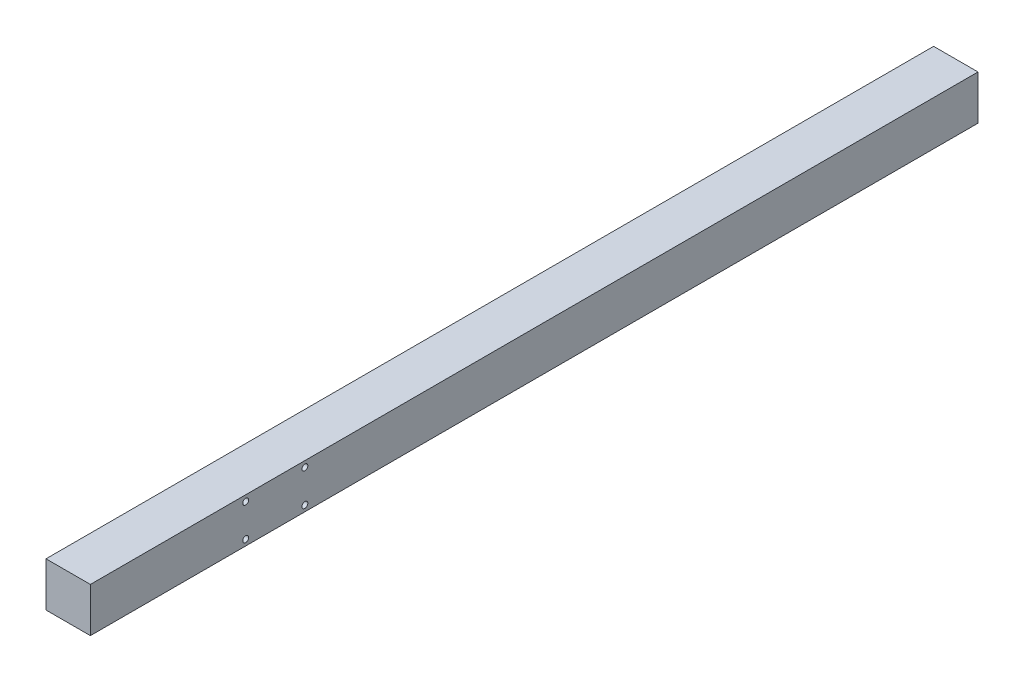
ISO-10303-21;
HEADER;
FILE_DESCRIPTION(('STEP AP214'),'2;1');
FILE_NAME('part.step','',(''),(''),'','','');
FILE_SCHEMA(('AUTOMOTIVE_DESIGN { 1 0 10303 214 1 1 1 1 }'));
ENDSEC;
DATA;
#1=APPLICATION_CONTEXT('core data for automotive mechanical design processes');
#2=APPLICATION_PROTOCOL_DEFINITION('international standard','automotive_design',2000,#1);
#3=PRODUCT_CONTEXT('',#1,'mechanical');
#4=PRODUCT('Part','Part','',(#3));
#5=PRODUCT_RELATED_PRODUCT_CATEGORY('part','',(#4));
#6=PRODUCT_DEFINITION_FORMATION('','',#4);
#7=PRODUCT_DEFINITION_CONTEXT('part definition',#1,'design');
#8=PRODUCT_DEFINITION('design','',#6,#7);
#9=PRODUCT_DEFINITION_SHAPE('','',#8);
#10=(LENGTH_UNIT() NAMED_UNIT(*) SI_UNIT(.MILLI.,.METRE.));
#11=(NAMED_UNIT(*) PLANE_ANGLE_UNIT() SI_UNIT($,.RADIAN.));
#12=(NAMED_UNIT(*) SI_UNIT($,.STERADIAN.) SOLID_ANGLE_UNIT());
#13=UNCERTAINTY_MEASURE_WITH_UNIT(LENGTH_MEASURE(1.E-05),#10,'distance_accuracy_value','');
#14=(GEOMETRIC_REPRESENTATION_CONTEXT(3) GLOBAL_UNCERTAINTY_ASSIGNED_CONTEXT((#13)) GLOBAL_UNIT_ASSIGNED_CONTEXT((#10,
#11,#12)) REPRESENTATION_CONTEXT('',''));
#15=CARTESIAN_POINT('',(0.,0.,0.));
#16=DIRECTION('',(0.,0.,1.));
#17=DIRECTION('',(1.,0.,0.));
#18=AXIS2_PLACEMENT_3D('',#15,#16,#17);
#19=CARTESIAN_POINT('',(15.,15.,600.));
#20=DIRECTION('',(-1.,0.,0.));
#21=DIRECTION('',(0.,-1.,0.));
#22=AXIS2_PLACEMENT_3D('',#19,#20,#21);
#23=PLANE('',#22);
#24=CARTESIAN_POINT('',(15.,11.,495.));
#25=DIRECTION('',(-1.,0.,0.));
#26=DIRECTION('',(0.,0.,1.));
#27=AXIS2_PLACEMENT_3D('',#24,#25,#26);
#28=CIRCLE('',#27,1.99999999999999);
#29=CARTESIAN_POINT('',(15.,11.,497.));
#30=VERTEX_POINT('',#29);
#31=EDGE_CURVE('E155',#30,#30,#28,.T.);
#32=ORIENTED_EDGE('',*,*,#31,.T.);
#33=EDGE_LOOP('',(#32));
#34=FACE_BOUND('',#33,.T.);
#35=CARTESIAN_POINT('',(15.,11.,455.));
#36=DIRECTION('',(-1.,0.,0.));
#37=DIRECTION('',(0.,0.,1.));
#38=AXIS2_PLACEMENT_3D('',#35,#36,#37);
#39=CIRCLE('',#38,1.99999999999999);
#40=CARTESIAN_POINT('',(15.,11.,457.));
#41=VERTEX_POINT('',#40);
#42=EDGE_CURVE('E149',#41,#41,#39,.T.);
#43=ORIENTED_EDGE('',*,*,#42,.T.);
#44=EDGE_LOOP('',(#43));
#45=FACE_BOUND('',#44,.T.);
#46=CARTESIAN_POINT('',(15.,-11.,455.));
#47=DIRECTION('',(-1.,0.,0.));
#48=DIRECTION('',(0.,0.,1.));
#49=AXIS2_PLACEMENT_3D('',#46,#47,#48);
#50=CIRCLE('',#49,1.99999999999999);
#51=CARTESIAN_POINT('',(15.,-11.,457.));
#52=VERTEX_POINT('',#51);
#53=EDGE_CURVE('E143',#52,#52,#50,.T.);
#54=ORIENTED_EDGE('',*,*,#53,.T.);
#55=EDGE_LOOP('',(#54));
#56=FACE_BOUND('',#55,.T.);
#57=CARTESIAN_POINT('',(15.,-11.,495.));
#58=DIRECTION('',(-1.,0.,0.));
#59=DIRECTION('',(0.,0.,1.));
#60=AXIS2_PLACEMENT_3D('',#57,#58,#59);
#61=CIRCLE('',#60,1.99999999999999);
#62=CARTESIAN_POINT('',(15.,-11.,497.));
#63=VERTEX_POINT('',#62);
#64=EDGE_CURVE('E124',#63,#63,#61,.T.);
#65=ORIENTED_EDGE('',*,*,#64,.T.);
#66=EDGE_LOOP('',(#65));
#67=FACE_BOUND('',#66,.T.);
#68=DIRECTION('',(0.,1.,0.));
#69=VECTOR('',#68,1.);
#70=CARTESIAN_POINT('',(15.,15.,0.));
#71=LINE('',#70,#69);
#72=CARTESIAN_POINT('',(15.,-15.,0.));
#73=VERTEX_POINT('',#72);
#74=CARTESIAN_POINT('',(15.,15.,0.));
#75=VERTEX_POINT('',#74);
#76=EDGE_CURVE('E100',#73,#75,#71,.T.);
#77=ORIENTED_EDGE('',*,*,#76,.T.);
#78=DIRECTION('',(0.,0.,-1.));
#79=VECTOR('',#78,1.);
#80=CARTESIAN_POINT('',(15.,15.,600.));
#81=LINE('',#80,#79);
#82=CARTESIAN_POINT('',(15.,15.,600.));
#83=VERTEX_POINT('',#82);
#84=EDGE_CURVE('E11',#83,#75,#81,.T.);
#85=ORIENTED_EDGE('',*,*,#84,.F.);
#86=DIRECTION('',(0.,1.,0.));
#87=VECTOR('',#86,1.);
#88=CARTESIAN_POINT('',(15.,15.,600.));
#89=LINE('',#88,#87);
#90=CARTESIAN_POINT('',(15.,-15.,600.));
#91=VERTEX_POINT('',#90);
#92=EDGE_CURVE('E88',#91,#83,#89,.T.);
#93=ORIENTED_EDGE('',*,*,#92,.F.);
#94=DIRECTION('',(0.,0.,-1.));
#95=VECTOR('',#94,1.);
#96=CARTESIAN_POINT('',(15.,-15.,600.));
#97=LINE('',#96,#95);
#98=EDGE_CURVE('E96',#91,#73,#97,.T.);
#99=ORIENTED_EDGE('',*,*,#98,.T.);
#100=EDGE_LOOP('',(#77,#85,#93,#99));
#101=FACE_BOUND('',#100,.T.);
#102=ADVANCED_FACE('F37',(#34,#45,#56,#67,#101),#23,.F.);
#103=CARTESIAN_POINT('',(-15.,15.,600.));
#104=DIRECTION('',(0.,-1.,0.));
#105=DIRECTION('',(0.,0.,-1.));
#106=AXIS2_PLACEMENT_3D('',#103,#104,#105);
#107=PLANE('',#106);
#108=DIRECTION('',(-1.,0.,0.));
#109=VECTOR('',#108,1.);
#110=CARTESIAN_POINT('',(-15.,15.,0.));
#111=LINE('',#110,#109);
#112=CARTESIAN_POINT('',(-15.,15.,0.));
#113=VERTEX_POINT('',#112);
#114=EDGE_CURVE('E92',#75,#113,#111,.T.);
#115=ORIENTED_EDGE('',*,*,#114,.T.);
#116=DIRECTION('',(0.,0.,-1.));
#117=VECTOR('',#116,1.);
#118=CARTESIAN_POINT('',(-15.,15.,600.));
#119=LINE('',#118,#117);
#120=CARTESIAN_POINT('',(-15.,15.,600.));
#121=VERTEX_POINT('',#120);
#122=EDGE_CURVE('E45',#121,#113,#119,.T.);
#123=ORIENTED_EDGE('',*,*,#122,.F.);
#124=DIRECTION('',(-1.,0.,0.));
#125=VECTOR('',#124,1.);
#126=CARTESIAN_POINT('',(-15.,15.,600.));
#127=LINE('',#126,#125);
#128=EDGE_CURVE('E83',#83,#121,#127,.T.);
#129=ORIENTED_EDGE('',*,*,#128,.F.);
#130=ORIENTED_EDGE('',*,*,#84,.T.);
#131=EDGE_LOOP('',(#115,#123,#129,#130));
#132=FACE_BOUND('',#131,.T.);
#133=ADVANCED_FACE('F91',(#132),#107,.F.);
#134=CARTESIAN_POINT('',(-15.,15.,600.));
#135=DIRECTION('',(1.,0.,0.));
#136=DIRECTION('',(0.,1.,0.));
#137=AXIS2_PLACEMENT_3D('',#134,#135,#136);
#138=PLANE('',#137);
#139=CARTESIAN_POINT('',(-15.,11.,495.));
#140=DIRECTION('',(-1.,0.,0.));
#141=DIRECTION('',(0.,0.,1.));
#142=AXIS2_PLACEMENT_3D('',#139,#140,#141);
#143=CIRCLE('',#142,2.);
#144=CARTESIAN_POINT('',(-15.,11.,497.));
#145=VERTEX_POINT('',#144);
#146=EDGE_CURVE('E158',#145,#145,#143,.T.);
#147=ORIENTED_EDGE('',*,*,#146,.F.);
#148=EDGE_LOOP('',(#147));
#149=FACE_BOUND('',#148,.T.);
#150=CARTESIAN_POINT('',(-15.,11.,455.));
#151=DIRECTION('',(-1.,0.,0.));
#152=DIRECTION('',(0.,0.,1.));
#153=AXIS2_PLACEMENT_3D('',#150,#151,#152);
#154=CIRCLE('',#153,2.);
#155=CARTESIAN_POINT('',(-15.,11.,457.));
#156=VERTEX_POINT('',#155);
#157=EDGE_CURVE('E152',#156,#156,#154,.T.);
#158=ORIENTED_EDGE('',*,*,#157,.F.);
#159=EDGE_LOOP('',(#158));
#160=FACE_BOUND('',#159,.T.);
#161=CARTESIAN_POINT('',(-15.,-11.,455.));
#162=DIRECTION('',(-1.,0.,0.));
#163=DIRECTION('',(0.,0.,1.));
#164=AXIS2_PLACEMENT_3D('',#161,#162,#163);
#165=CIRCLE('',#164,2.);
#166=CARTESIAN_POINT('',(-15.,-11.,457.));
#167=VERTEX_POINT('',#166);
#168=EDGE_CURVE('E146',#167,#167,#165,.T.);
#169=ORIENTED_EDGE('',*,*,#168,.F.);
#170=EDGE_LOOP('',(#169));
#171=FACE_BOUND('',#170,.T.);
#172=CARTESIAN_POINT('',(-15.,-11.,495.));
#173=DIRECTION('',(-1.,0.,0.));
#174=DIRECTION('',(0.,0.,1.));
#175=AXIS2_PLACEMENT_3D('',#172,#173,#174);
#176=CIRCLE('',#175,2.);
#177=CARTESIAN_POINT('',(-15.,-11.,497.));
#178=VERTEX_POINT('',#177);
#179=EDGE_CURVE('E140',#178,#178,#176,.T.);
#180=ORIENTED_EDGE('',*,*,#179,.F.);
#181=EDGE_LOOP('',(#180));
#182=FACE_BOUND('',#181,.T.);
#183=DIRECTION('',(0.,-1.,0.));
#184=VECTOR('',#183,1.);
#185=CARTESIAN_POINT('',(-15.,15.,0.));
#186=LINE('',#185,#184);
#187=CARTESIAN_POINT('',(-15.,-15.,0.));
#188=VERTEX_POINT('',#187);
#189=EDGE_CURVE('E70',#113,#188,#186,.T.);
#190=ORIENTED_EDGE('',*,*,#189,.T.);
#191=DIRECTION('',(0.,0.,-1.));
#192=VECTOR('',#191,1.);
#193=CARTESIAN_POINT('',(-15.,-15.,600.));
#194=LINE('',#193,#192);
#195=CARTESIAN_POINT('',(-15.,-15.,600.));
#196=VERTEX_POINT('',#195);
#197=EDGE_CURVE('E93',#196,#188,#194,.T.);
#198=ORIENTED_EDGE('',*,*,#197,.F.);
#199=DIRECTION('',(0.,-1.,0.));
#200=VECTOR('',#199,1.);
#201=CARTESIAN_POINT('',(-15.,15.,600.));
#202=LINE('',#201,#200);
#203=EDGE_CURVE('E86',#121,#196,#202,.T.);
#204=ORIENTED_EDGE('',*,*,#203,.F.);
#205=ORIENTED_EDGE('',*,*,#122,.T.);
#206=EDGE_LOOP('',(#190,#198,#204,#205));
#207=FACE_BOUND('',#206,.T.);
#208=ADVANCED_FACE('F94',(#149,#160,#171,#182,#207),#138,.F.);
#209=CARTESIAN_POINT('',(-15.,-15.,600.));
#210=DIRECTION('',(0.,1.,0.));
#211=DIRECTION('',(0.,0.,1.));
#212=AXIS2_PLACEMENT_3D('',#209,#210,#211);
#213=PLANE('',#212);
#214=DIRECTION('',(1.,0.,0.));
#215=VECTOR('',#214,1.);
#216=CARTESIAN_POINT('',(-15.,-15.,0.));
#217=LINE('',#216,#215);
#218=EDGE_CURVE('E76',#188,#73,#217,.T.);
#219=ORIENTED_EDGE('',*,*,#218,.T.);
#220=ORIENTED_EDGE('',*,*,#98,.F.);
#221=DIRECTION('',(1.,0.,0.));
#222=VECTOR('',#221,1.);
#223=CARTESIAN_POINT('',(-15.,-15.,600.));
#224=LINE('',#223,#222);
#225=EDGE_CURVE('E53',#196,#91,#224,.T.);
#226=ORIENTED_EDGE('',*,*,#225,.F.);
#227=ORIENTED_EDGE('',*,*,#197,.T.);
#228=EDGE_LOOP('',(#219,#220,#226,#227));
#229=FACE_BOUND('',#228,.T.);
#230=ADVANCED_FACE('F108',(#229),#213,.F.);
#231=CARTESIAN_POINT('',(0.,0.,600.));
#232=DIRECTION('',(0.,0.,1.));
#233=DIRECTION('',(1.,0.,0.));
#234=AXIS2_PLACEMENT_3D('',#231,#232,#233);
#235=PLANE('',#234);
#236=ORIENTED_EDGE('',*,*,#92,.T.);
#237=ORIENTED_EDGE('',*,*,#128,.T.);
#238=ORIENTED_EDGE('',*,*,#203,.T.);
#239=ORIENTED_EDGE('',*,*,#225,.T.);
#240=EDGE_LOOP('',(#236,#237,#238,#239));
#241=FACE_BOUND('',#240,.T.);
#242=ADVANCED_FACE('F84',(#241),#235,.T.);
#243=CARTESIAN_POINT('',(0.,0.,0.));
#244=DIRECTION('',(0.,0.,1.));
#245=DIRECTION('',(1.,0.,0.));
#246=AXIS2_PLACEMENT_3D('',#243,#244,#245);
#247=PLANE('',#246);
#248=CARTESIAN_POINT('',(10.,-10.,0.));
#249=DIRECTION('',(0.,0.,-1.));
#250=DIRECTION('',(-1.,0.,0.));
#251=AXIS2_PLACEMENT_3D('',#248,#249,#250);
#252=CIRCLE('',#251,2.5);
#253=CARTESIAN_POINT('',(7.5,-10.,0.));
#254=VERTEX_POINT('',#253);
#255=EDGE_CURVE('E120',#254,#254,#252,.T.);
#256=ORIENTED_EDGE('',*,*,#255,.F.);
#257=EDGE_LOOP('',(#256));
#258=FACE_BOUND('',#257,.T.);
#259=CARTESIAN_POINT('',(-10.,-10.,0.));
#260=DIRECTION('',(0.,0.,-1.));
#261=DIRECTION('',(-1.,0.,0.));
#262=AXIS2_PLACEMENT_3D('',#259,#260,#261);
#263=CIRCLE('',#262,2.5);
#264=CARTESIAN_POINT('',(-12.5,-10.,0.));
#265=VERTEX_POINT('',#264);
#266=EDGE_CURVE('E127',#265,#265,#263,.T.);
#267=ORIENTED_EDGE('',*,*,#266,.F.);
#268=EDGE_LOOP('',(#267));
#269=FACE_BOUND('',#268,.T.);
#270=CARTESIAN_POINT('',(-10.,10.,0.));
#271=DIRECTION('',(0.,0.,-1.));
#272=DIRECTION('',(-1.,0.,0.));
#273=AXIS2_PLACEMENT_3D('',#270,#271,#272);
#274=CIRCLE('',#273,2.5);
#275=CARTESIAN_POINT('',(-12.5,10.,0.));
#276=VERTEX_POINT('',#275);
#277=EDGE_CURVE('E133',#276,#276,#274,.T.);
#278=ORIENTED_EDGE('',*,*,#277,.F.);
#279=EDGE_LOOP('',(#278));
#280=FACE_BOUND('',#279,.T.);
#281=CARTESIAN_POINT('',(10.,10.,0.));
#282=DIRECTION('',(0.,0.,-1.));
#283=DIRECTION('',(-1.,0.,0.));
#284=AXIS2_PLACEMENT_3D('',#281,#282,#283);
#285=CIRCLE('',#284,2.5);
#286=CARTESIAN_POINT('',(7.5,10.,0.));
#287=VERTEX_POINT('',#286);
#288=EDGE_CURVE('E114',#287,#287,#285,.T.);
#289=ORIENTED_EDGE('',*,*,#288,.F.);
#290=EDGE_LOOP('',(#289));
#291=FACE_BOUND('',#290,.T.);
#292=ORIENTED_EDGE('',*,*,#76,.F.);
#293=ORIENTED_EDGE('',*,*,#218,.F.);
#294=ORIENTED_EDGE('',*,*,#189,.F.);
#295=ORIENTED_EDGE('',*,*,#114,.F.);
#296=EDGE_LOOP('',(#292,#293,#294,#295));
#297=FACE_BOUND('',#296,.T.);
#298=ADVANCED_FACE('F111',(#258,#269,#280,#291,#297),#247,.F.);
#299=CARTESIAN_POINT('',(10.,10.,30.));
#300=DIRECTION('',(0.,0.,-1.));
#301=DIRECTION('',(-1.,0.,0.));
#302=AXIS2_PLACEMENT_3D('',#299,#300,#301);
#303=CYLINDRICAL_SURFACE('',#302,2.5);
#304=CARTESIAN_POINT('',(10.,10.,30.));
#305=DIRECTION('',(0.,0.,-1.));
#306=DIRECTION('',(-1.,0.,0.));
#307=AXIS2_PLACEMENT_3D('',#304,#305,#306);
#308=CIRCLE('',#307,2.5);
#309=CARTESIAN_POINT('',(7.5,10.,30.));
#310=VERTEX_POINT('',#309);
#311=EDGE_CURVE('E103',#310,#310,#308,.T.);
#312=ORIENTED_EDGE('',*,*,#311,.F.);
#313=EDGE_LOOP('',(#312));
#314=FACE_BOUND('',#313,.T.);
#315=ORIENTED_EDGE('',*,*,#288,.T.);
#316=EDGE_LOOP('',(#315));
#317=FACE_BOUND('',#316,.T.);
#318=ADVANCED_FACE('F264',(#314,#317),#303,.F.);
#319=CARTESIAN_POINT('',(10.,10.,30.));
#320=DIRECTION('',(0.,0.,-1.));
#321=DIRECTION('',(-1.,0.,0.));
#322=AXIS2_PLACEMENT_3D('',#319,#320,#321);
#323=PLANE('',#322);
#324=ORIENTED_EDGE('',*,*,#311,.T.);
#325=EDGE_LOOP('',(#324));
#326=FACE_BOUND('',#325,.T.);
#327=ADVANCED_FACE('F272',(#326),#323,.T.);
#328=CARTESIAN_POINT('',(-10.,10.,30.));
#329=DIRECTION('',(0.,0.,-1.));
#330=DIRECTION('',(-1.,0.,0.));
#331=AXIS2_PLACEMENT_3D('',#328,#329,#330);
#332=CYLINDRICAL_SURFACE('',#331,2.5);
#333=CARTESIAN_POINT('',(-10.,10.,30.));
#334=DIRECTION('',(0.,0.,-1.));
#335=DIRECTION('',(-1.,0.,0.));
#336=AXIS2_PLACEMENT_3D('',#333,#334,#335);
#337=CIRCLE('',#336,2.5);
#338=CARTESIAN_POINT('',(-12.5,10.,30.));
#339=VERTEX_POINT('',#338);
#340=EDGE_CURVE('E117',#339,#339,#337,.T.);
#341=ORIENTED_EDGE('',*,*,#340,.F.);
#342=EDGE_LOOP('',(#341));
#343=FACE_BOUND('',#342,.T.);
#344=ORIENTED_EDGE('',*,*,#277,.T.);
#345=EDGE_LOOP('',(#344));
#346=FACE_BOUND('',#345,.T.);
#347=ADVANCED_FACE('F280',(#343,#346),#332,.F.);
#348=CARTESIAN_POINT('',(-10.,10.,30.));
#349=DIRECTION('',(0.,0.,-1.));
#350=DIRECTION('',(-1.,0.,0.));
#351=AXIS2_PLACEMENT_3D('',#348,#349,#350);
#352=PLANE('',#351);
#353=ORIENTED_EDGE('',*,*,#340,.T.);
#354=EDGE_LOOP('',(#353));
#355=FACE_BOUND('',#354,.T.);
#356=ADVANCED_FACE('F288',(#355),#352,.T.);
#357=CARTESIAN_POINT('',(-10.,-10.,30.));
#358=DIRECTION('',(0.,0.,-1.));
#359=DIRECTION('',(-1.,0.,0.));
#360=AXIS2_PLACEMENT_3D('',#357,#358,#359);
#361=CYLINDRICAL_SURFACE('',#360,2.5);
#362=CARTESIAN_POINT('',(-10.,-10.,30.));
#363=DIRECTION('',(0.,0.,-1.));
#364=DIRECTION('',(-1.,0.,0.));
#365=AXIS2_PLACEMENT_3D('',#362,#363,#364);
#366=CIRCLE('',#365,2.5);
#367=CARTESIAN_POINT('',(-12.5,-10.,30.));
#368=VERTEX_POINT('',#367);
#369=EDGE_CURVE('E130',#368,#368,#366,.T.);
#370=ORIENTED_EDGE('',*,*,#369,.F.);
#371=EDGE_LOOP('',(#370));
#372=FACE_BOUND('',#371,.T.);
#373=ORIENTED_EDGE('',*,*,#266,.T.);
#374=EDGE_LOOP('',(#373));
#375=FACE_BOUND('',#374,.T.);
#376=ADVANCED_FACE('F296',(#372,#375),#361,.F.);
#377=CARTESIAN_POINT('',(-10.,-10.,30.));
#378=DIRECTION('',(0.,0.,-1.));
#379=DIRECTION('',(-1.,0.,0.));
#380=AXIS2_PLACEMENT_3D('',#377,#378,#379);
#381=PLANE('',#380);
#382=ORIENTED_EDGE('',*,*,#369,.T.);
#383=EDGE_LOOP('',(#382));
#384=FACE_BOUND('',#383,.T.);
#385=ADVANCED_FACE('F303',(#384),#381,.T.);
#386=CARTESIAN_POINT('',(10.,-10.,30.));
#387=DIRECTION('',(0.,0.,-1.));
#388=DIRECTION('',(-1.,0.,0.));
#389=AXIS2_PLACEMENT_3D('',#386,#387,#388);
#390=CYLINDRICAL_SURFACE('',#389,2.5);
#391=CARTESIAN_POINT('',(10.,-10.,30.));
#392=DIRECTION('',(0.,0.,-1.));
#393=DIRECTION('',(-1.,0.,0.));
#394=AXIS2_PLACEMENT_3D('',#391,#392,#393);
#395=CIRCLE('',#394,2.5);
#396=CARTESIAN_POINT('',(7.5,-10.,30.));
#397=VERTEX_POINT('',#396);
#398=EDGE_CURVE('E123',#397,#397,#395,.T.);
#399=ORIENTED_EDGE('',*,*,#398,.F.);
#400=EDGE_LOOP('',(#399));
#401=FACE_BOUND('',#400,.T.);
#402=ORIENTED_EDGE('',*,*,#255,.T.);
#403=EDGE_LOOP('',(#402));
#404=FACE_BOUND('',#403,.T.);
#405=ADVANCED_FACE('F186',(#401,#404),#390,.F.);
#406=CARTESIAN_POINT('',(10.,-10.,30.));
#407=DIRECTION('',(0.,0.,-1.));
#408=DIRECTION('',(-1.,0.,0.));
#409=AXIS2_PLACEMENT_3D('',#406,#407,#408);
#410=PLANE('',#409);
#411=ORIENTED_EDGE('',*,*,#398,.T.);
#412=EDGE_LOOP('',(#411));
#413=FACE_BOUND('',#412,.T.);
#414=ADVANCED_FACE('F176',(#413),#410,.T.);
#415=CARTESIAN_POINT('',(-15.,-11.,495.));
#416=DIRECTION('',(-1.,0.,0.));
#417=DIRECTION('',(0.,0.,1.));
#418=AXIS2_PLACEMENT_3D('',#415,#416,#417);
#419=CYLINDRICAL_SURFACE('',#418,2.);
#420=ORIENTED_EDGE('',*,*,#64,.F.);
#421=EDGE_LOOP('',(#420));
#422=FACE_BOUND('',#421,.T.);
#423=ORIENTED_EDGE('',*,*,#179,.T.);
#424=EDGE_LOOP('',(#423));
#425=FACE_BOUND('',#424,.T.);
#426=ADVANCED_FACE('F173',(#422,#425),#419,.F.);
#427=CARTESIAN_POINT('',(-15.,-11.,455.));
#428=DIRECTION('',(-1.,0.,0.));
#429=DIRECTION('',(0.,0.,1.));
#430=AXIS2_PLACEMENT_3D('',#427,#428,#429);
#431=CYLINDRICAL_SURFACE('',#430,2.);
#432=ORIENTED_EDGE('',*,*,#53,.F.);
#433=EDGE_LOOP('',(#432));
#434=FACE_BOUND('',#433,.T.);
#435=ORIENTED_EDGE('',*,*,#168,.T.);
#436=EDGE_LOOP('',(#435));
#437=FACE_BOUND('',#436,.T.);
#438=ADVANCED_FACE('F175',(#434,#437),#431,.F.);
#439=CARTESIAN_POINT('',(-15.,11.,455.));
#440=DIRECTION('',(-1.,0.,0.));
#441=DIRECTION('',(0.,0.,1.));
#442=AXIS2_PLACEMENT_3D('',#439,#440,#441);
#443=CYLINDRICAL_SURFACE('',#442,2.);
#444=ORIENTED_EDGE('',*,*,#42,.F.);
#445=EDGE_LOOP('',(#444));
#446=FACE_BOUND('',#445,.T.);
#447=ORIENTED_EDGE('',*,*,#157,.T.);
#448=EDGE_LOOP('',(#447));
#449=FACE_BOUND('',#448,.T.);
#450=ADVANCED_FACE('F183',(#446,#449),#443,.F.);
#451=CARTESIAN_POINT('',(-15.,11.,495.));
#452=DIRECTION('',(-1.,0.,0.));
#453=DIRECTION('',(0.,0.,1.));
#454=AXIS2_PLACEMENT_3D('',#451,#452,#453);
#455=CYLINDRICAL_SURFACE('',#454,2.);
#456=ORIENTED_EDGE('',*,*,#31,.F.);
#457=EDGE_LOOP('',(#456));
#458=FACE_BOUND('',#457,.T.);
#459=ORIENTED_EDGE('',*,*,#146,.T.);
#460=EDGE_LOOP('',(#459));
#461=FACE_BOUND('',#460,.T.);
#462=ADVANCED_FACE('F162',(#458,#461),#455,.F.);
#463=CLOSED_SHELL('',(#102,#133,#208,#230,#242,#298,#318,#327,#347,#356,#376,#385,#405,#414,
#426,#438,#450,#462));
#464=MANIFOLD_SOLID_BREP('B2',#463);
#465=ADVANCED_BREP_SHAPE_REPRESENTATION('',(#18,#464),#14);
#466=SHAPE_DEFINITION_REPRESENTATION(#9,#465);
ENDSEC;
END-ISO-10303-21;
